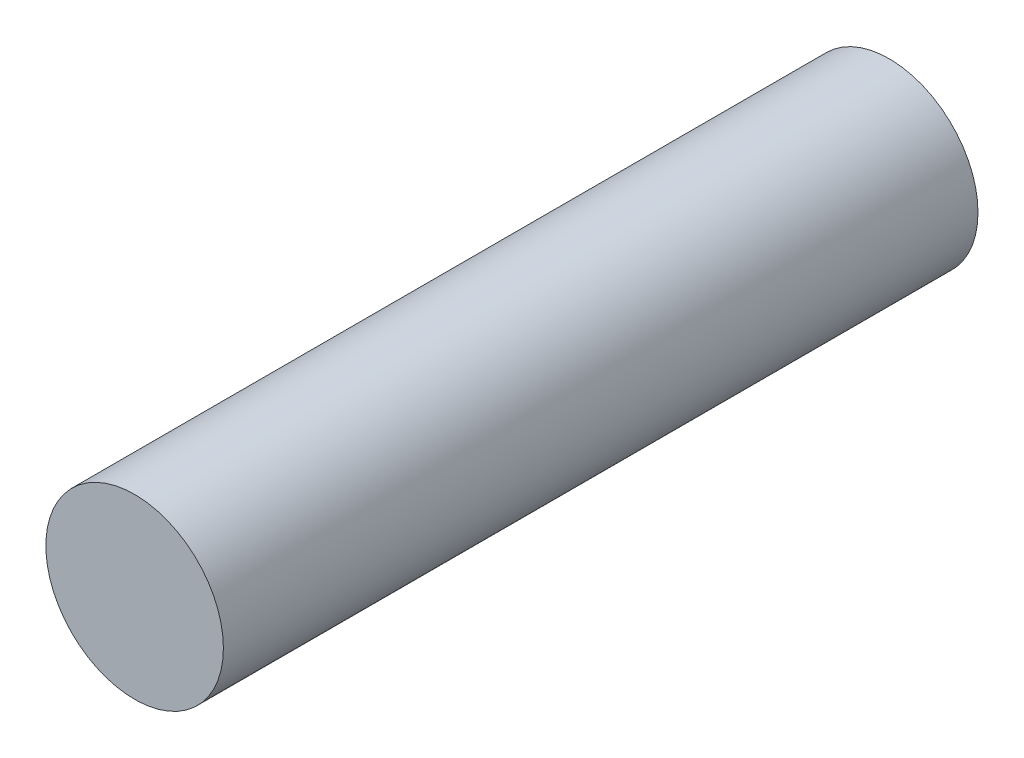
ISO-10303-21;
HEADER;
FILE_DESCRIPTION(('STEP AP214'),'2;1');
FILE_NAME('part.step','',(''),(''),'','','');
FILE_SCHEMA(('AUTOMOTIVE_DESIGN { 1 0 10303 214 1 1 1 1 }'));
ENDSEC;
DATA;
#1=APPLICATION_CONTEXT('core data for automotive mechanical design processes');
#2=APPLICATION_PROTOCOL_DEFINITION('international standard','automotive_design',2000,#1);
#3=PRODUCT_CONTEXT('',#1,'mechanical');
#4=PRODUCT('Part','Part','',(#3));
#5=PRODUCT_RELATED_PRODUCT_CATEGORY('part','',(#4));
#6=PRODUCT_DEFINITION_FORMATION('','',#4);
#7=PRODUCT_DEFINITION_CONTEXT('part definition',#1,'design');
#8=PRODUCT_DEFINITION('design','',#6,#7);
#9=PRODUCT_DEFINITION_SHAPE('','',#8);
#10=(LENGTH_UNIT() NAMED_UNIT(*) SI_UNIT(.MILLI.,.METRE.));
#11=(NAMED_UNIT(*) PLANE_ANGLE_UNIT() SI_UNIT($,.RADIAN.));
#12=(NAMED_UNIT(*) SI_UNIT($,.STERADIAN.) SOLID_ANGLE_UNIT());
#13=UNCERTAINTY_MEASURE_WITH_UNIT(LENGTH_MEASURE(1.E-05),#10,'distance_accuracy_value','');
#14=(GEOMETRIC_REPRESENTATION_CONTEXT(3) GLOBAL_UNCERTAINTY_ASSIGNED_CONTEXT((#13)) GLOBAL_UNIT_ASSIGNED_CONTEXT((#10,
#11,#12)) REPRESENTATION_CONTEXT('',''));
#15=CARTESIAN_POINT('',(0.,0.,0.));
#16=DIRECTION('',(0.,0.,1.));
#17=DIRECTION('',(1.,0.,0.));
#18=AXIS2_PLACEMENT_3D('',#15,#16,#17);
#19=CARTESIAN_POINT('',(0.,0.,8.5));
#20=DIRECTION('',(0.,0.,-1.));
#21=DIRECTION('',(-1.,0.,0.));
#22=AXIS2_PLACEMENT_3D('',#19,#20,#21);
#23=CYLINDRICAL_SURFACE('',#22,1.);
#24=CARTESIAN_POINT('',(0.,0.,8.5));
#25=DIRECTION('',(0.,0.,1.));
#26=DIRECTION('',(1.,0.,0.));
#27=AXIS2_PLACEMENT_3D('',#24,#25,#26);
#28=CIRCLE('',#27,1.);
#29=CARTESIAN_POINT('',(1.,0.,8.5));
#30=VERTEX_POINT('',#29);
#31=EDGE_CURVE('E10',#30,#30,#28,.T.);
#32=ORIENTED_EDGE('',*,*,#31,.F.);
#33=EDGE_LOOP('',(#32));
#34=FACE_BOUND('',#33,.T.);
#35=CARTESIAN_POINT('',(0.,0.,0.));
#36=DIRECTION('',(0.,0.,1.));
#37=DIRECTION('',(1.,0.,0.));
#38=AXIS2_PLACEMENT_3D('',#35,#36,#37);
#39=CIRCLE('',#38,1.);
#40=CARTESIAN_POINT('',(1.,0.,0.));
#41=VERTEX_POINT('',#40);
#42=EDGE_CURVE('E36',#41,#41,#39,.T.);
#43=ORIENTED_EDGE('',*,*,#42,.T.);
#44=EDGE_LOOP('',(#43));
#45=FACE_BOUND('',#44,.T.);
#46=ADVANCED_FACE('F33',(#34,#45),#23,.T.);
#47=CARTESIAN_POINT('',(0.,0.,8.5));
#48=DIRECTION('',(0.,0.,1.));
#49=DIRECTION('',(1.,0.,0.));
#50=AXIS2_PLACEMENT_3D('',#47,#48,#49);
#51=PLANE('',#50);
#52=ORIENTED_EDGE('',*,*,#31,.T.);
#53=EDGE_LOOP('',(#52));
#54=FACE_BOUND('',#53,.T.);
#55=ADVANCED_FACE('F48',(#54),#51,.T.);
#56=CARTESIAN_POINT('',(0.,0.,0.));
#57=DIRECTION('',(0.,0.,1.));
#58=DIRECTION('',(1.,0.,0.));
#59=AXIS2_PLACEMENT_3D('',#56,#57,#58);
#60=PLANE('',#59);
#61=ORIENTED_EDGE('',*,*,#42,.F.);
#62=EDGE_LOOP('',(#61));
#63=FACE_BOUND('',#62,.T.);
#64=ADVANCED_FACE('F46',(#63),#60,.F.);
#65=CLOSED_SHELL('',(#46,#55,#64));
#66=MANIFOLD_SOLID_BREP('B2',#65);
#67=ADVANCED_BREP_SHAPE_REPRESENTATION('',(#18,#66),#14);
#68=SHAPE_DEFINITION_REPRESENTATION(#9,#67);
ENDSEC;
END-ISO-10303-21;
